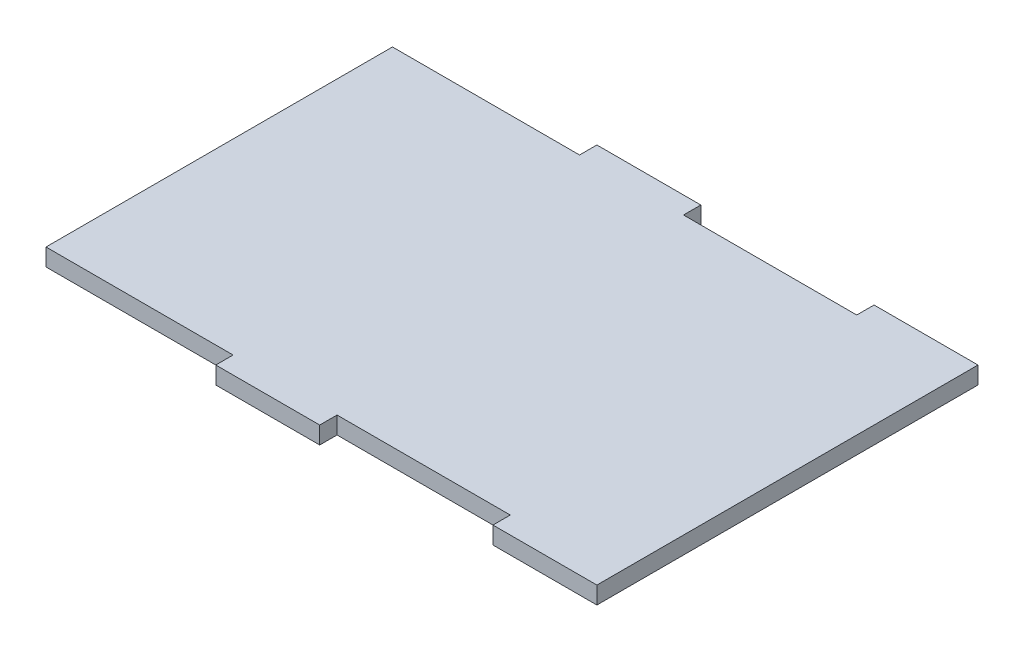
ISO-10303-21;
HEADER;
FILE_DESCRIPTION(('STEP AP214'),'2;1');
FILE_NAME('part.step','',(''),(''),'','','');
FILE_SCHEMA(('AUTOMOTIVE_DESIGN { 1 0 10303 214 1 1 1 1 }'));
ENDSEC;
DATA;
#1=APPLICATION_CONTEXT('core data for automotive mechanical design processes');
#2=APPLICATION_PROTOCOL_DEFINITION('international standard','automotive_design',2000,#1);
#3=PRODUCT_CONTEXT('',#1,'mechanical');
#4=PRODUCT('Part','Part','',(#3));
#5=PRODUCT_RELATED_PRODUCT_CATEGORY('part','',(#4));
#6=PRODUCT_DEFINITION_FORMATION('','',#4);
#7=PRODUCT_DEFINITION_CONTEXT('part definition',#1,'design');
#8=PRODUCT_DEFINITION('design','',#6,#7);
#9=PRODUCT_DEFINITION_SHAPE('','',#8);
#10=(LENGTH_UNIT() NAMED_UNIT(*) SI_UNIT(.MILLI.,.METRE.));
#11=(NAMED_UNIT(*) PLANE_ANGLE_UNIT() SI_UNIT($,.RADIAN.));
#12=(NAMED_UNIT(*) SI_UNIT($,.STERADIAN.) SOLID_ANGLE_UNIT());
#13=UNCERTAINTY_MEASURE_WITH_UNIT(LENGTH_MEASURE(1.E-05),#10,'distance_accuracy_value','');
#14=(GEOMETRIC_REPRESENTATION_CONTEXT(3) GLOBAL_UNCERTAINTY_ASSIGNED_CONTEXT((#13)) GLOBAL_UNIT_ASSIGNED_CONTEXT((#10,
#11,#12)) REPRESENTATION_CONTEXT('',''));
#15=CARTESIAN_POINT('',(0.,0.,0.));
#16=DIRECTION('',(0.,0.,1.));
#17=DIRECTION('',(1.,0.,0.));
#18=AXIS2_PLACEMENT_3D('',#15,#16,#17);
#19=CARTESIAN_POINT('',(0.,3.175,0.));
#20=DIRECTION('',(1.,0.,0.));
#21=DIRECTION('',(0.,0.,-1.));
#22=AXIS2_PLACEMENT_3D('',#19,#20,#21);
#23=PLANE('',#22);
#24=DIRECTION('',(0.,0.,1.));
#25=VECTOR('',#24,1.);
#26=CARTESIAN_POINT('',(0.,0.,0.));
#27=LINE('',#26,#25);
#28=CARTESIAN_POINT('',(0.,0.,-63.5));
#29=VERTEX_POINT('',#28);
#30=CARTESIAN_POINT('',(0.,0.,0.));
#31=VERTEX_POINT('',#30);
#32=EDGE_CURVE('E177',#29,#31,#27,.T.);
#33=ORIENTED_EDGE('',*,*,#32,.T.);
#34=DIRECTION('',(0.,-1.,0.));
#35=VECTOR('',#34,1.);
#36=CARTESIAN_POINT('',(0.,3.175,0.));
#37=LINE('',#36,#35);
#38=CARTESIAN_POINT('',(0.,3.175,0.));
#39=VERTEX_POINT('',#38);
#40=EDGE_CURVE('E11',#39,#31,#37,.T.);
#41=ORIENTED_EDGE('',*,*,#40,.F.);
#42=DIRECTION('',(0.,0.,1.));
#43=VECTOR('',#42,1.);
#44=CARTESIAN_POINT('',(0.,3.175,0.));
#45=LINE('',#44,#43);
#46=CARTESIAN_POINT('',(0.,3.175,-63.5));
#47=VERTEX_POINT('',#46);
#48=EDGE_CURVE('E208',#47,#39,#45,.T.);
#49=ORIENTED_EDGE('',*,*,#48,.F.);
#50=DIRECTION('',(0.,-1.,0.));
#51=VECTOR('',#50,1.);
#52=CARTESIAN_POINT('',(0.,3.175,-63.5));
#53=LINE('',#52,#51);
#54=EDGE_CURVE('E173',#47,#29,#53,.T.);
#55=ORIENTED_EDGE('',*,*,#54,.T.);
#56=EDGE_LOOP('',(#33,#41,#49,#55));
#57=FACE_BOUND('',#56,.T.);
#58=ADVANCED_FACE('F33',(#57),#23,.F.);
#59=CARTESIAN_POINT('',(0.,3.175,0.));
#60=DIRECTION('',(0.,0.,-1.));
#61=DIRECTION('',(-1.,0.,0.));
#62=AXIS2_PLACEMENT_3D('',#59,#60,#61);
#63=PLANE('',#62);
#64=DIRECTION('',(1.,0.,0.));
#65=VECTOR('',#64,1.);
#66=CARTESIAN_POINT('',(0.,0.,0.));
#67=LINE('',#66,#65);
#68=CARTESIAN_POINT('',(34.29,0.,-3.60822483003176E-13));
#69=VERTEX_POINT('',#68);
#70=EDGE_CURVE('E180',#31,#69,#67,.T.);
#71=ORIENTED_EDGE('',*,*,#70,.T.);
#72=DIRECTION('',(0.,-1.,0.));
#73=VECTOR('',#72,1.);
#74=CARTESIAN_POINT('',(34.29,3.175,-3.60822483003176E-13));
#75=LINE('',#74,#73);
#76=CARTESIAN_POINT('',(34.29,3.175,-3.60822483003176E-13));
#77=VERTEX_POINT('',#76);
#78=EDGE_CURVE('E41',#77,#69,#75,.T.);
#79=ORIENTED_EDGE('',*,*,#78,.F.);
#80=DIRECTION('',(1.,0.,0.));
#81=VECTOR('',#80,1.);
#82=CARTESIAN_POINT('',(0.,3.175,0.));
#83=LINE('',#82,#81);
#84=EDGE_CURVE('E116',#39,#77,#83,.T.);
#85=ORIENTED_EDGE('',*,*,#84,.F.);
#86=ORIENTED_EDGE('',*,*,#40,.T.);
#87=EDGE_LOOP('',(#71,#79,#85,#86));
#88=FACE_BOUND('',#87,.T.);
#89=ADVANCED_FACE('F306',(#88),#63,.F.);
#90=CARTESIAN_POINT('',(34.29,3.175,3.17499999999964));
#91=DIRECTION('',(1.,0.,0.));
#92=DIRECTION('',(0.,0.,-1.));
#93=AXIS2_PLACEMENT_3D('',#90,#91,#92);
#94=PLANE('',#93);
#95=DIRECTION('',(0.,0.,1.));
#96=VECTOR('',#95,1.);
#97=CARTESIAN_POINT('',(34.29,0.,3.17499999999964));
#98=LINE('',#97,#96);
#99=CARTESIAN_POINT('',(34.29,0.,3.17499999999964));
#100=VERTEX_POINT('',#99);
#101=EDGE_CURVE('E182',#69,#100,#98,.T.);
#102=ORIENTED_EDGE('',*,*,#101,.T.);
#103=DIRECTION('',(0.,-1.,0.));
#104=VECTOR('',#103,1.);
#105=CARTESIAN_POINT('',(34.29,3.175,3.17499999999964));
#106=LINE('',#105,#104);
#107=CARTESIAN_POINT('',(34.29,3.175,3.17499999999964));
#108=VERTEX_POINT('',#107);
#109=EDGE_CURVE('E239',#108,#100,#106,.T.);
#110=ORIENTED_EDGE('',*,*,#109,.F.);
#111=DIRECTION('',(0.,0.,1.));
#112=VECTOR('',#111,1.);
#113=CARTESIAN_POINT('',(34.29,3.175,3.17499999999964));
#114=LINE('',#113,#112);
#115=EDGE_CURVE('E247',#77,#108,#114,.T.);
#116=ORIENTED_EDGE('',*,*,#115,.F.);
#117=ORIENTED_EDGE('',*,*,#78,.T.);
#118=EDGE_LOOP('',(#102,#110,#116,#117));
#119=FACE_BOUND('',#118,.T.);
#120=ADVANCED_FACE('F245',(#119),#94,.F.);
#121=CARTESIAN_POINT('',(53.34,3.175,3.17499999999964));
#122=DIRECTION('',(0.,0.,-1.));
#123=DIRECTION('',(-1.,0.,0.));
#124=AXIS2_PLACEMENT_3D('',#121,#122,#123);
#125=PLANE('',#124);
#126=DIRECTION('',(1.,0.,0.));
#127=VECTOR('',#126,1.);
#128=CARTESIAN_POINT('',(53.34,0.,3.17499999999964));
#129=LINE('',#128,#127);
#130=CARTESIAN_POINT('',(53.34,0.,3.17499999999964));
#131=VERTEX_POINT('',#130);
#132=EDGE_CURVE('E184',#100,#131,#129,.T.);
#133=ORIENTED_EDGE('',*,*,#132,.T.);
#134=DIRECTION('',(0.,-1.,0.));
#135=VECTOR('',#134,1.);
#136=CARTESIAN_POINT('',(53.34,3.175,3.17499999999964));
#137=LINE('',#136,#135);
#138=CARTESIAN_POINT('',(53.34,3.175,3.17499999999964));
#139=VERTEX_POINT('',#138);
#140=EDGE_CURVE('E236',#139,#131,#137,.T.);
#141=ORIENTED_EDGE('',*,*,#140,.F.);
#142=DIRECTION('',(1.,0.,0.));
#143=VECTOR('',#142,1.);
#144=CARTESIAN_POINT('',(53.34,3.175,3.17499999999964));
#145=LINE('',#144,#143);
#146=EDGE_CURVE('E265',#108,#139,#145,.T.);
#147=ORIENTED_EDGE('',*,*,#146,.F.);
#148=ORIENTED_EDGE('',*,*,#109,.T.);
#149=EDGE_LOOP('',(#133,#141,#147,#148));
#150=FACE_BOUND('',#149,.T.);
#151=ADVANCED_FACE('F256',(#150),#125,.F.);
#152=CARTESIAN_POINT('',(53.34,3.175,-3.60822483003176E-13));
#153=DIRECTION('',(-1.,0.,0.));
#154=DIRECTION('',(0.,0.,1.));
#155=AXIS2_PLACEMENT_3D('',#152,#153,#154);
#156=PLANE('',#155);
#157=DIRECTION('',(0.,0.,-1.));
#158=VECTOR('',#157,1.);
#159=CARTESIAN_POINT('',(53.34,0.,-3.60822483003176E-13));
#160=LINE('',#159,#158);
#161=CARTESIAN_POINT('',(53.34,0.,-3.60822483003176E-13));
#162=VERTEX_POINT('',#161);
#163=EDGE_CURVE('E186',#131,#162,#160,.T.);
#164=ORIENTED_EDGE('',*,*,#163,.T.);
#165=DIRECTION('',(0.,-1.,0.));
#166=VECTOR('',#165,1.);
#167=CARTESIAN_POINT('',(53.34,3.175,-3.60822483003176E-13));
#168=LINE('',#167,#166);
#169=CARTESIAN_POINT('',(53.34,3.175,-3.60822483003176E-13));
#170=VERTEX_POINT('',#169);
#171=EDGE_CURVE('E233',#170,#162,#168,.T.);
#172=ORIENTED_EDGE('',*,*,#171,.F.);
#173=DIRECTION('',(0.,0.,-1.));
#174=VECTOR('',#173,1.);
#175=CARTESIAN_POINT('',(53.34,3.175,-3.60822483003176E-13));
#176=LINE('',#175,#174);
#177=EDGE_CURVE('E262',#139,#170,#176,.T.);
#178=ORIENTED_EDGE('',*,*,#177,.F.);
#179=ORIENTED_EDGE('',*,*,#140,.T.);
#180=EDGE_LOOP('',(#164,#172,#178,#179));
#181=FACE_BOUND('',#180,.T.);
#182=ADVANCED_FACE('F260',(#181),#156,.F.);
#183=CARTESIAN_POINT('',(53.34,3.175,-3.60822483003176E-13));
#184=DIRECTION('',(0.,0.,-1.));
#185=DIRECTION('',(-1.,0.,0.));
#186=AXIS2_PLACEMENT_3D('',#183,#184,#185);
#187=PLANE('',#186);
#188=DIRECTION('',(1.,0.,0.));
#189=VECTOR('',#188,1.);
#190=CARTESIAN_POINT('',(53.34,0.,-3.60822483003176E-13));
#191=LINE('',#190,#189);
#192=CARTESIAN_POINT('',(85.0899999999999,0.,0.));
#193=VERTEX_POINT('',#192);
#194=EDGE_CURVE('E188',#162,#193,#191,.T.);
#195=ORIENTED_EDGE('',*,*,#194,.T.);
#196=DIRECTION('',(0.,-1.,0.));
#197=VECTOR('',#196,1.);
#198=CARTESIAN_POINT('',(85.0899999999999,3.175,0.));
#199=LINE('',#198,#197);
#200=CARTESIAN_POINT('',(85.0899999999999,3.175,0.));
#201=VERTEX_POINT('',#200);
#202=EDGE_CURVE('E230',#201,#193,#199,.T.);
#203=ORIENTED_EDGE('',*,*,#202,.F.);
#204=DIRECTION('',(1.,0.,0.));
#205=VECTOR('',#204,1.);
#206=CARTESIAN_POINT('',(53.34,3.175,-3.60822483003176E-13));
#207=LINE('',#206,#205);
#208=EDGE_CURVE('E264',#170,#201,#207,.T.);
#209=ORIENTED_EDGE('',*,*,#208,.F.);
#210=ORIENTED_EDGE('',*,*,#171,.T.);
#211=EDGE_LOOP('',(#195,#203,#209,#210));
#212=FACE_BOUND('',#211,.T.);
#213=ADVANCED_FACE('F319',(#212),#187,.F.);
#214=CARTESIAN_POINT('',(85.09,3.175,3.175));
#215=DIRECTION('',(1.,0.,0.));
#216=DIRECTION('',(0.,0.,-1.));
#217=AXIS2_PLACEMENT_3D('',#214,#215,#216);
#218=PLANE('',#217);
#219=DIRECTION('',(0.,0.,1.));
#220=VECTOR('',#219,1.);
#221=CARTESIAN_POINT('',(85.09,0.,3.175));
#222=LINE('',#221,#220);
#223=CARTESIAN_POINT('',(85.09,0.,3.175));
#224=VERTEX_POINT('',#223);
#225=EDGE_CURVE('E190',#193,#224,#222,.T.);
#226=ORIENTED_EDGE('',*,*,#225,.T.);
#227=DIRECTION('',(0.,-1.,0.));
#228=VECTOR('',#227,1.);
#229=CARTESIAN_POINT('',(85.09,3.175,3.175));
#230=LINE('',#229,#228);
#231=CARTESIAN_POINT('',(85.09,3.175,3.175));
#232=VERTEX_POINT('',#231);
#233=EDGE_CURVE('E227',#232,#224,#230,.T.);
#234=ORIENTED_EDGE('',*,*,#233,.F.);
#235=DIRECTION('',(0.,0.,1.));
#236=VECTOR('',#235,1.);
#237=CARTESIAN_POINT('',(85.09,3.175,3.175));
#238=LINE('',#237,#236);
#239=EDGE_CURVE('E267',#201,#232,#238,.T.);
#240=ORIENTED_EDGE('',*,*,#239,.F.);
#241=ORIENTED_EDGE('',*,*,#202,.T.);
#242=EDGE_LOOP('',(#226,#234,#240,#241));
#243=FACE_BOUND('',#242,.T.);
#244=ADVANCED_FACE('F322',(#243),#218,.F.);
#245=CARTESIAN_POINT('',(104.14,3.175,3.175));
#246=DIRECTION('',(0.,0.,-1.));
#247=DIRECTION('',(-1.,0.,0.));
#248=AXIS2_PLACEMENT_3D('',#245,#246,#247);
#249=PLANE('',#248);
#250=DIRECTION('',(1.,0.,0.));
#251=VECTOR('',#250,1.);
#252=CARTESIAN_POINT('',(104.14,0.,3.175));
#253=LINE('',#252,#251);
#254=CARTESIAN_POINT('',(104.14,0.,3.175));
#255=VERTEX_POINT('',#254);
#256=EDGE_CURVE('E192',#224,#255,#253,.T.);
#257=ORIENTED_EDGE('',*,*,#256,.T.);
#258=DIRECTION('',(0.,-1.,0.));
#259=VECTOR('',#258,1.);
#260=CARTESIAN_POINT('',(104.14,3.175,3.175));
#261=LINE('',#260,#259);
#262=CARTESIAN_POINT('',(104.14,3.175,3.175));
#263=VERTEX_POINT('',#262);
#264=EDGE_CURVE('E224',#263,#255,#261,.T.);
#265=ORIENTED_EDGE('',*,*,#264,.F.);
#266=DIRECTION('',(1.,0.,0.));
#267=VECTOR('',#266,1.);
#268=CARTESIAN_POINT('',(104.14,3.175,3.175));
#269=LINE('',#268,#267);
#270=EDGE_CURVE('E273',#232,#263,#269,.T.);
#271=ORIENTED_EDGE('',*,*,#270,.F.);
#272=ORIENTED_EDGE('',*,*,#233,.T.);
#273=EDGE_LOOP('',(#257,#265,#271,#272));
#274=FACE_BOUND('',#273,.T.);
#275=ADVANCED_FACE('F326',(#274),#249,.F.);
#276=CARTESIAN_POINT('',(104.14,3.175,-63.5));
#277=DIRECTION('',(-1.,0.,0.));
#278=DIRECTION('',(0.,0.,1.));
#279=AXIS2_PLACEMENT_3D('',#276,#277,#278);
#280=PLANE('',#279);
#281=DIRECTION('',(0.,0.,-1.));
#282=VECTOR('',#281,1.);
#283=CARTESIAN_POINT('',(104.14,0.,-63.5));
#284=LINE('',#283,#282);
#285=CARTESIAN_POINT('',(104.14,0.,-66.675));
#286=VERTEX_POINT('',#285);
#287=EDGE_CURVE('E195',#255,#286,#284,.T.);
#288=ORIENTED_EDGE('',*,*,#287,.T.);
#289=DIRECTION('',(0.,-1.,0.));
#290=VECTOR('',#289,1.);
#291=CARTESIAN_POINT('',(104.14,3.175,-66.675));
#292=LINE('',#291,#290);
#293=CARTESIAN_POINT('',(104.14,3.175,-66.675));
#294=VERTEX_POINT('',#293);
#295=EDGE_CURVE('E221',#294,#286,#292,.T.);
#296=ORIENTED_EDGE('',*,*,#295,.F.);
#297=DIRECTION('',(0.,0.,-1.));
#298=VECTOR('',#297,1.);
#299=CARTESIAN_POINT('',(104.14,3.175,0.));
#300=LINE('',#299,#298);
#301=EDGE_CURVE('E275',#263,#294,#300,.T.);
#302=ORIENTED_EDGE('',*,*,#301,.F.);
#303=ORIENTED_EDGE('',*,*,#264,.T.);
#304=EDGE_LOOP('',(#288,#296,#302,#303));
#305=FACE_BOUND('',#304,.T.);
#306=ADVANCED_FACE('F330',(#305),#280,.F.);
#307=CARTESIAN_POINT('',(104.14,3.175,-66.675));
#308=DIRECTION('',(0.,0.,1.));
#309=DIRECTION('',(1.,0.,0.));
#310=AXIS2_PLACEMENT_3D('',#307,#308,#309);
#311=PLANE('',#310);
#312=DIRECTION('',(-1.,0.,0.));
#313=VECTOR('',#312,1.);
#314=CARTESIAN_POINT('',(104.14,0.,-66.675));
#315=LINE('',#314,#313);
#316=CARTESIAN_POINT('',(85.09,0.,-66.675));
#317=VERTEX_POINT('',#316);
#318=EDGE_CURVE('E197',#286,#317,#315,.T.);
#319=ORIENTED_EDGE('',*,*,#318,.T.);
#320=DIRECTION('',(0.,-1.,0.));
#321=VECTOR('',#320,1.);
#322=CARTESIAN_POINT('',(85.09,3.175,-66.675));
#323=LINE('',#322,#321);
#324=CARTESIAN_POINT('',(85.09,3.175,-66.675));
#325=VERTEX_POINT('',#324);
#326=EDGE_CURVE('E218',#325,#317,#323,.T.);
#327=ORIENTED_EDGE('',*,*,#326,.F.);
#328=DIRECTION('',(-1.,0.,0.));
#329=VECTOR('',#328,1.);
#330=CARTESIAN_POINT('',(104.14,3.175,-66.675));
#331=LINE('',#330,#329);
#332=EDGE_CURVE('E277',#294,#325,#331,.T.);
#333=ORIENTED_EDGE('',*,*,#332,.F.);
#334=ORIENTED_EDGE('',*,*,#295,.T.);
#335=EDGE_LOOP('',(#319,#327,#333,#334));
#336=FACE_BOUND('',#335,.T.);
#337=ADVANCED_FACE('F334',(#336),#311,.F.);
#338=CARTESIAN_POINT('',(85.09,3.175,-66.675));
#339=DIRECTION('',(1.,0.,0.));
#340=DIRECTION('',(0.,0.,-1.));
#341=AXIS2_PLACEMENT_3D('',#338,#339,#340);
#342=PLANE('',#341);
#343=DIRECTION('',(0.,0.,1.));
#344=VECTOR('',#343,1.);
#345=CARTESIAN_POINT('',(85.09,0.,-66.675));
#346=LINE('',#345,#344);
#347=CARTESIAN_POINT('',(85.09,0.,-63.5));
#348=VERTEX_POINT('',#347);
#349=EDGE_CURVE('E199',#317,#348,#346,.T.);
#350=ORIENTED_EDGE('',*,*,#349,.T.);
#351=DIRECTION('',(0.,-1.,0.));
#352=VECTOR('',#351,1.);
#353=CARTESIAN_POINT('',(85.09,3.175,-63.5));
#354=LINE('',#353,#352);
#355=CARTESIAN_POINT('',(85.09,3.175,-63.5));
#356=VERTEX_POINT('',#355);
#357=EDGE_CURVE('E215',#356,#348,#354,.T.);
#358=ORIENTED_EDGE('',*,*,#357,.F.);
#359=DIRECTION('',(0.,0.,1.));
#360=VECTOR('',#359,1.);
#361=CARTESIAN_POINT('',(85.09,3.175,-66.675));
#362=LINE('',#361,#360);
#363=EDGE_CURVE('E279',#325,#356,#362,.T.);
#364=ORIENTED_EDGE('',*,*,#363,.F.);
#365=ORIENTED_EDGE('',*,*,#326,.T.);
#366=EDGE_LOOP('',(#350,#358,#364,#365));
#367=FACE_BOUND('',#366,.T.);
#368=ADVANCED_FACE('F338',(#367),#342,.F.);
#369=CARTESIAN_POINT('',(53.34,3.175,-63.4999999999996));
#370=DIRECTION('',(0.,0.,1.));
#371=DIRECTION('',(1.,0.,0.));
#372=AXIS2_PLACEMENT_3D('',#369,#370,#371);
#373=PLANE('',#372);
#374=DIRECTION('',(-1.,0.,0.));
#375=VECTOR('',#374,1.);
#376=CARTESIAN_POINT('',(53.34,0.,-63.4999999999996));
#377=LINE('',#376,#375);
#378=CARTESIAN_POINT('',(53.34,0.,-63.4999999999996));
#379=VERTEX_POINT('',#378);
#380=EDGE_CURVE('E201',#348,#379,#377,.T.);
#381=ORIENTED_EDGE('',*,*,#380,.T.);
#382=DIRECTION('',(0.,-1.,0.));
#383=VECTOR('',#382,1.);
#384=CARTESIAN_POINT('',(53.34,3.175,-63.4999999999996));
#385=LINE('',#384,#383);
#386=CARTESIAN_POINT('',(53.34,3.175,-63.4999999999996));
#387=VERTEX_POINT('',#386);
#388=EDGE_CURVE('E212',#387,#379,#385,.T.);
#389=ORIENTED_EDGE('',*,*,#388,.F.);
#390=DIRECTION('',(-1.,0.,0.));
#391=VECTOR('',#390,1.);
#392=CARTESIAN_POINT('',(53.34,3.175,-63.4999999999996));
#393=LINE('',#392,#391);
#394=EDGE_CURVE('E281',#356,#387,#393,.T.);
#395=ORIENTED_EDGE('',*,*,#394,.F.);
#396=ORIENTED_EDGE('',*,*,#357,.T.);
#397=EDGE_LOOP('',(#381,#389,#395,#396));
#398=FACE_BOUND('',#397,.T.);
#399=ADVANCED_FACE('F287',(#398),#373,.F.);
#400=CARTESIAN_POINT('',(53.34,3.175,-63.4999999999996));
#401=DIRECTION('',(-1.,0.,0.));
#402=DIRECTION('',(0.,0.,1.));
#403=AXIS2_PLACEMENT_3D('',#400,#401,#402);
#404=PLANE('',#403);
#405=DIRECTION('',(0.,0.,-1.));
#406=VECTOR('',#405,1.);
#407=CARTESIAN_POINT('',(53.34,0.,-63.4999999999996));
#408=LINE('',#407,#406);
#409=CARTESIAN_POINT('',(53.34,0.,-66.6749999999996));
#410=VERTEX_POINT('',#409);
#411=EDGE_CURVE('E203',#379,#410,#408,.T.);
#412=ORIENTED_EDGE('',*,*,#411,.T.);
#413=DIRECTION('',(0.,-1.,0.));
#414=VECTOR('',#413,1.);
#415=CARTESIAN_POINT('',(53.34,3.175,-66.6749999999996));
#416=LINE('',#415,#414);
#417=CARTESIAN_POINT('',(53.34,3.175,-66.6749999999996));
#418=VERTEX_POINT('',#417);
#419=EDGE_CURVE('E168',#418,#410,#416,.T.);
#420=ORIENTED_EDGE('',*,*,#419,.F.);
#421=DIRECTION('',(0.,0.,-1.));
#422=VECTOR('',#421,1.);
#423=CARTESIAN_POINT('',(53.34,3.175,-63.4999999999996));
#424=LINE('',#423,#422);
#425=EDGE_CURVE('E159',#387,#418,#424,.T.);
#426=ORIENTED_EDGE('',*,*,#425,.F.);
#427=ORIENTED_EDGE('',*,*,#388,.T.);
#428=EDGE_LOOP('',(#412,#420,#426,#427));
#429=FACE_BOUND('',#428,.T.);
#430=ADVANCED_FACE('F291',(#429),#404,.F.);
#431=CARTESIAN_POINT('',(53.34,3.175,-66.6749999999996));
#432=DIRECTION('',(0.,0.,1.));
#433=DIRECTION('',(1.,0.,0.));
#434=AXIS2_PLACEMENT_3D('',#431,#432,#433);
#435=PLANE('',#434);
#436=DIRECTION('',(-1.,0.,0.));
#437=VECTOR('',#436,1.);
#438=CARTESIAN_POINT('',(53.34,0.,-66.6749999999996));
#439=LINE('',#438,#437);
#440=CARTESIAN_POINT('',(34.29,0.,-66.6749999999996));
#441=VERTEX_POINT('',#440);
#442=EDGE_CURVE('E167',#410,#441,#439,.T.);
#443=ORIENTED_EDGE('',*,*,#442,.T.);
#444=DIRECTION('',(0.,-1.,0.));
#445=VECTOR('',#444,1.);
#446=CARTESIAN_POINT('',(34.29,3.175,-66.6749999999996));
#447=LINE('',#446,#445);
#448=CARTESIAN_POINT('',(34.29,3.175,-66.6749999999996));
#449=VERTEX_POINT('',#448);
#450=EDGE_CURVE('E164',#449,#441,#447,.T.);
#451=ORIENTED_EDGE('',*,*,#450,.F.);
#452=DIRECTION('',(-1.,0.,0.));
#453=VECTOR('',#452,1.);
#454=CARTESIAN_POINT('',(53.34,3.175,-66.6749999999996));
#455=LINE('',#454,#453);
#456=EDGE_CURVE('E153',#418,#449,#455,.T.);
#457=ORIENTED_EDGE('',*,*,#456,.F.);
#458=ORIENTED_EDGE('',*,*,#419,.T.);
#459=EDGE_LOOP('',(#443,#451,#457,#458));
#460=FACE_BOUND('',#459,.T.);
#461=ADVANCED_FACE('F165',(#460),#435,.F.);
#462=CARTESIAN_POINT('',(34.29,3.175,-66.6749999999996));
#463=DIRECTION('',(1.,0.,0.));
#464=DIRECTION('',(0.,0.,-1.));
#465=AXIS2_PLACEMENT_3D('',#462,#463,#464);
#466=PLANE('',#465);
#467=DIRECTION('',(0.,0.,1.));
#468=VECTOR('',#467,1.);
#469=CARTESIAN_POINT('',(34.29,0.,-66.6749999999996));
#470=LINE('',#469,#468);
#471=CARTESIAN_POINT('',(34.29,0.,-63.4999999999996));
#472=VERTEX_POINT('',#471);
#473=EDGE_CURVE('E102',#441,#472,#470,.T.);
#474=ORIENTED_EDGE('',*,*,#473,.T.);
#475=DIRECTION('',(0.,-1.,0.));
#476=VECTOR('',#475,1.);
#477=CARTESIAN_POINT('',(34.29,3.175,-63.4999999999996));
#478=LINE('',#477,#476);
#479=CARTESIAN_POINT('',(34.29,3.175,-63.4999999999996));
#480=VERTEX_POINT('',#479);
#481=EDGE_CURVE('E169',#480,#472,#478,.T.);
#482=ORIENTED_EDGE('',*,*,#481,.F.);
#483=DIRECTION('',(0.,0.,1.));
#484=VECTOR('',#483,1.);
#485=CARTESIAN_POINT('',(34.29,3.175,-66.6749999999996));
#486=LINE('',#485,#484);
#487=EDGE_CURVE('E157',#449,#480,#486,.T.);
#488=ORIENTED_EDGE('',*,*,#487,.F.);
#489=ORIENTED_EDGE('',*,*,#450,.T.);
#490=EDGE_LOOP('',(#474,#482,#488,#489));
#491=FACE_BOUND('',#490,.T.);
#492=ADVANCED_FACE('F171',(#491),#466,.F.);
#493=CARTESIAN_POINT('',(0.,3.175,-63.5));
#494=DIRECTION('',(0.,0.,1.));
#495=DIRECTION('',(1.,0.,0.));
#496=AXIS2_PLACEMENT_3D('',#493,#494,#495);
#497=PLANE('',#496);
#498=DIRECTION('',(-1.,0.,0.));
#499=VECTOR('',#498,1.);
#500=CARTESIAN_POINT('',(0.,0.,-63.5));
#501=LINE('',#500,#499);
#502=EDGE_CURVE('E108',#472,#29,#501,.T.);
#503=ORIENTED_EDGE('',*,*,#502,.T.);
#504=ORIENTED_EDGE('',*,*,#54,.F.);
#505=DIRECTION('',(-1.,0.,0.));
#506=VECTOR('',#505,1.);
#507=CARTESIAN_POINT('',(0.,3.175,-63.5));
#508=LINE('',#507,#506);
#509=EDGE_CURVE('E49',#480,#47,#508,.T.);
#510=ORIENTED_EDGE('',*,*,#509,.F.);
#511=ORIENTED_EDGE('',*,*,#481,.T.);
#512=EDGE_LOOP('',(#503,#504,#510,#511));
#513=FACE_BOUND('',#512,.T.);
#514=ADVANCED_FACE('F295',(#513),#497,.F.);
#515=CARTESIAN_POINT('',(0.,3.175,0.));
#516=DIRECTION('',(0.,-1.,0.));
#517=DIRECTION('',(0.,0.,-1.));
#518=AXIS2_PLACEMENT_3D('',#515,#516,#517);
#519=PLANE('',#518);
#520=ORIENTED_EDGE('',*,*,#48,.T.);
#521=ORIENTED_EDGE('',*,*,#84,.T.);
#522=ORIENTED_EDGE('',*,*,#115,.T.);
#523=ORIENTED_EDGE('',*,*,#146,.T.);
#524=ORIENTED_EDGE('',*,*,#177,.T.);
#525=ORIENTED_EDGE('',*,*,#208,.T.);
#526=ORIENTED_EDGE('',*,*,#239,.T.);
#527=ORIENTED_EDGE('',*,*,#270,.T.);
#528=ORIENTED_EDGE('',*,*,#301,.T.);
#529=ORIENTED_EDGE('',*,*,#332,.T.);
#530=ORIENTED_EDGE('',*,*,#363,.T.);
#531=ORIENTED_EDGE('',*,*,#394,.T.);
#532=ORIENTED_EDGE('',*,*,#425,.T.);
#533=ORIENTED_EDGE('',*,*,#456,.T.);
#534=ORIENTED_EDGE('',*,*,#487,.T.);
#535=ORIENTED_EDGE('',*,*,#509,.T.);
#536=EDGE_LOOP('',(#520,#521,#522,#523,#524,#525,#526,#527,#528,#529,#530,#531,#532,#533,#534,#535));
#537=FACE_BOUND('',#536,.T.);
#538=ADVANCED_FACE('F155',(#537),#519,.F.);
#539=CARTESIAN_POINT('',(0.,0.,0.));
#540=DIRECTION('',(0.,-1.,0.));
#541=DIRECTION('',(0.,0.,-1.));
#542=AXIS2_PLACEMENT_3D('',#539,#540,#541);
#543=PLANE('',#542);
#544=ORIENTED_EDGE('',*,*,#32,.F.);
#545=ORIENTED_EDGE('',*,*,#502,.F.);
#546=ORIENTED_EDGE('',*,*,#473,.F.);
#547=ORIENTED_EDGE('',*,*,#442,.F.);
#548=ORIENTED_EDGE('',*,*,#411,.F.);
#549=ORIENTED_EDGE('',*,*,#380,.F.);
#550=ORIENTED_EDGE('',*,*,#349,.F.);
#551=ORIENTED_EDGE('',*,*,#318,.F.);
#552=ORIENTED_EDGE('',*,*,#287,.F.);
#553=ORIENTED_EDGE('',*,*,#256,.F.);
#554=ORIENTED_EDGE('',*,*,#225,.F.);
#555=ORIENTED_EDGE('',*,*,#194,.F.);
#556=ORIENTED_EDGE('',*,*,#163,.F.);
#557=ORIENTED_EDGE('',*,*,#132,.F.);
#558=ORIENTED_EDGE('',*,*,#101,.F.);
#559=ORIENTED_EDGE('',*,*,#70,.F.);
#560=EDGE_LOOP('',(#544,#545,#546,#547,#548,#549,#550,#551,#552,#553,#554,#555,#556,#557,#558,#559));
#561=FACE_BOUND('',#560,.T.);
#562=ADVANCED_FACE('F251',(#561),#543,.T.);
#563=CLOSED_SHELL('',(#58,#89,#120,#151,#182,#213,#244,#275,#306,#337,#368,#399,#430,#461,#492,
#514,#538,#562));
#564=MANIFOLD_SOLID_BREP('B2',#563);
#565=ADVANCED_BREP_SHAPE_REPRESENTATION('',(#18,#564),#14);
#566=SHAPE_DEFINITION_REPRESENTATION(#9,#565);
ENDSEC;
END-ISO-10303-21;
